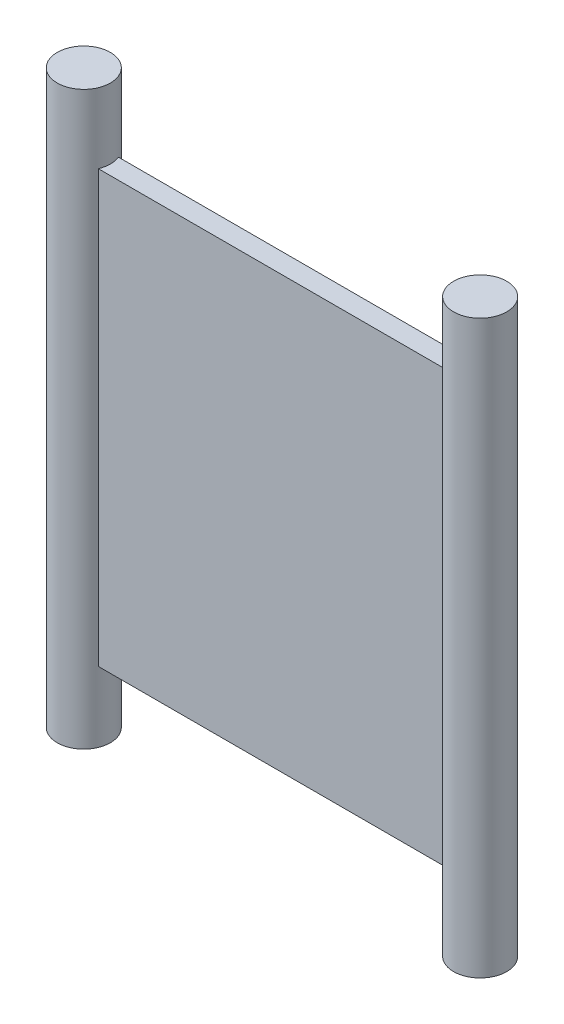
ISO-10303-21;
HEADER;
FILE_DESCRIPTION(('STEP AP214'),'2;1');
FILE_NAME('part.step','',(''),(''),'','','');
FILE_SCHEMA(('AUTOMOTIVE_DESIGN { 1 0 10303 214 1 1 1 1 }'));
ENDSEC;
DATA;
#1=APPLICATION_CONTEXT('core data for automotive mechanical design processes');
#2=APPLICATION_PROTOCOL_DEFINITION('international standard','automotive_design',2000,#1);
#3=PRODUCT_CONTEXT('',#1,'mechanical');
#4=PRODUCT('Part','Part','',(#3));
#5=PRODUCT_RELATED_PRODUCT_CATEGORY('part','',(#4));
#6=PRODUCT_DEFINITION_FORMATION('','',#4);
#7=PRODUCT_DEFINITION_CONTEXT('part definition',#1,'design');
#8=PRODUCT_DEFINITION('design','',#6,#7);
#9=PRODUCT_DEFINITION_SHAPE('','',#8);
#10=(LENGTH_UNIT() NAMED_UNIT(*) SI_UNIT(.MILLI.,.METRE.));
#11=(NAMED_UNIT(*) PLANE_ANGLE_UNIT() SI_UNIT($,.RADIAN.));
#12=(NAMED_UNIT(*) SI_UNIT($,.STERADIAN.) SOLID_ANGLE_UNIT());
#13=UNCERTAINTY_MEASURE_WITH_UNIT(LENGTH_MEASURE(1.E-05),#10,'distance_accuracy_value','');
#14=(GEOMETRIC_REPRESENTATION_CONTEXT(3) GLOBAL_UNCERTAINTY_ASSIGNED_CONTEXT((#13)) GLOBAL_UNIT_ASSIGNED_CONTEXT((#10,
#11,#12)) REPRESENTATION_CONTEXT('',''));
#15=CARTESIAN_POINT('',(0.,0.,0.));
#16=DIRECTION('',(0.,0.,1.));
#17=DIRECTION('',(1.,0.,0.));
#18=AXIS2_PLACEMENT_3D('',#15,#16,#17);
#19=CARTESIAN_POINT('',(9.885,21.5,0.499999999999999));
#20=DIRECTION('',(0.,0.,-1.));
#21=DIRECTION('',(-1.,0.,0.));
#22=AXIS2_PLACEMENT_3D('',#19,#20,#21);
#23=PLANE('',#22);
#24=DIRECTION('',(0.,-1.,0.));
#25=VECTOR('',#24,1.);
#26=CARTESIAN_POINT('',(8.6579608808192,25.,0.499999999999999));
#27=LINE('',#26,#25);
#28=CARTESIAN_POINT('',(8.6579608808192,21.5,0.499999999999999));
#29=VERTEX_POINT('',#28);
#30=CARTESIAN_POINT('',(8.6579608808192,0.,0.499999999999999));
#31=VERTEX_POINT('',#30);
#32=EDGE_CURVE('E53',#29,#31,#27,.T.);
#33=ORIENTED_EDGE('',*,*,#32,.F.);
#34=DIRECTION('',(1.,0.,0.));
#35=VECTOR('',#34,1.);
#36=CARTESIAN_POINT('',(9.885,21.5,0.499999999999999));
#37=LINE('',#36,#35);
#38=CARTESIAN_POINT('',(-8.65796088081919,21.5,0.500000000000001));
#39=VERTEX_POINT('',#38);
#40=EDGE_CURVE('E90',#39,#29,#37,.T.);
#41=ORIENTED_EDGE('',*,*,#40,.F.);
#42=DIRECTION('',(0.,-1.,0.));
#43=VECTOR('',#42,1.);
#44=CARTESIAN_POINT('',(-8.65796088081919,25.,0.500000000000001));
#45=LINE('',#44,#43);
#46=CARTESIAN_POINT('',(-8.65796088081919,0.,0.500000000000001));
#47=VERTEX_POINT('',#46);
#48=EDGE_CURVE('E103',#47,#39,#45,.F.);
#49=ORIENTED_EDGE('',*,*,#48,.F.);
#50=DIRECTION('',(1.,0.,0.));
#51=VECTOR('',#50,1.);
#52=CARTESIAN_POINT('',(9.885,0.,0.499999999999999));
#53=LINE('',#52,#51);
#54=EDGE_CURVE('E91',#47,#31,#53,.T.);
#55=ORIENTED_EDGE('',*,*,#54,.T.);
#56=EDGE_LOOP('',(#33,#41,#49,#55));
#57=FACE_BOUND('',#56,.T.);
#58=ADVANCED_FACE('F39',(#57),#23,.F.);
#59=CARTESIAN_POINT('',(9.885,21.5,-0.500000000000001));
#60=DIRECTION('',(0.,0.,1.));
#61=DIRECTION('',(1.,0.,0.));
#62=AXIS2_PLACEMENT_3D('',#59,#60,#61);
#63=PLANE('',#62);
#64=DIRECTION('',(0.,-1.,0.));
#65=VECTOR('',#64,1.);
#66=CARTESIAN_POINT('',(8.6579608808192,25.,-0.500000000000001));
#67=LINE('',#66,#65);
#68=CARTESIAN_POINT('',(8.6579608808192,0.,-0.500000000000001));
#69=VERTEX_POINT('',#68);
#70=CARTESIAN_POINT('',(8.6579608808192,21.5,-0.500000000000001));
#71=VERTEX_POINT('',#70);
#72=EDGE_CURVE('E78',#69,#71,#67,.F.);
#73=ORIENTED_EDGE('',*,*,#72,.F.);
#74=DIRECTION('',(-1.,0.,0.));
#75=VECTOR('',#74,1.);
#76=CARTESIAN_POINT('',(9.885,0.,-0.500000000000001));
#77=LINE('',#76,#75);
#78=CARTESIAN_POINT('',(-8.65796088081919,0.,-0.499999999999999));
#79=VERTEX_POINT('',#78);
#80=EDGE_CURVE('E60',#69,#79,#77,.T.);
#81=ORIENTED_EDGE('',*,*,#80,.T.);
#82=DIRECTION('',(0.,-1.,0.));
#83=VECTOR('',#82,1.);
#84=CARTESIAN_POINT('',(-8.65796088081919,25.,-0.499999999999999));
#85=LINE('',#84,#83);
#86=CARTESIAN_POINT('',(-8.65796088081919,21.5,-0.499999999999999));
#87=VERTEX_POINT('',#86);
#88=EDGE_CURVE('E105',#87,#79,#85,.T.);
#89=ORIENTED_EDGE('',*,*,#88,.F.);
#90=DIRECTION('',(-1.,0.,0.));
#91=VECTOR('',#90,1.);
#92=CARTESIAN_POINT('',(9.885,21.5,-0.500000000000001));
#93=LINE('',#92,#91);
#94=EDGE_CURVE('E85',#71,#87,#93,.T.);
#95=ORIENTED_EDGE('',*,*,#94,.F.);
#96=EDGE_LOOP('',(#73,#81,#89,#95));
#97=FACE_BOUND('',#96,.T.);
#98=ADVANCED_FACE('F84',(#97),#63,.F.);
#99=CARTESIAN_POINT('',(-9.885,25.,0.));
#100=DIRECTION('',(0.,-1.,0.));
#101=DIRECTION('',(0.,0.,-1.));
#102=AXIS2_PLACEMENT_3D('',#99,#100,#101);
#103=CYLINDRICAL_SURFACE('',#102,1.325);
#104=CARTESIAN_POINT('',(-9.885,25.,0.));
#105=DIRECTION('',(0.,1.,0.));
#106=DIRECTION('',(0.,0.,1.));
#107=AXIS2_PLACEMENT_3D('',#104,#105,#106);
#108=CIRCLE('',#107,1.325);
#109=CARTESIAN_POINT('',(-9.885,25.,1.325));
#110=VERTEX_POINT('',#109);
#111=EDGE_CURVE('E107',#110,#110,#108,.T.);
#112=ORIENTED_EDGE('',*,*,#111,.F.);
#113=EDGE_LOOP('',(#112));
#114=FACE_BOUND('',#113,.T.);
#115=CARTESIAN_POINT('',(-9.885,-3.5,0.));
#116=DIRECTION('',(0.,1.,0.));
#117=DIRECTION('',(0.,0.,1.));
#118=AXIS2_PLACEMENT_3D('',#115,#116,#117);
#119=CIRCLE('',#118,1.325);
#120=CARTESIAN_POINT('',(-9.885,-3.5,1.325));
#121=VERTEX_POINT('',#120);
#122=EDGE_CURVE('E108',#121,#121,#119,.T.);
#123=ORIENTED_EDGE('',*,*,#122,.T.);
#124=EDGE_LOOP('',(#123));
#125=FACE_BOUND('',#124,.T.);
#126=ORIENTED_EDGE('',*,*,#48,.T.);
#127=CARTESIAN_POINT('',(-9.885,21.5,0.));
#128=DIRECTION('',(0.,-1.,0.));
#129=DIRECTION('',(0.,0.,-1.));
#130=AXIS2_PLACEMENT_3D('',#127,#128,#129);
#131=CIRCLE('',#130,1.325);
#132=EDGE_CURVE('E95',#39,#87,#131,.F.);
#133=ORIENTED_EDGE('',*,*,#132,.T.);
#134=ORIENTED_EDGE('',*,*,#88,.T.);
#135=CARTESIAN_POINT('',(-9.885,0.,0.));
#136=DIRECTION('',(0.,-1.,0.));
#137=DIRECTION('',(0.,0.,-1.));
#138=AXIS2_PLACEMENT_3D('',#135,#136,#137);
#139=CIRCLE('',#138,1.325);
#140=EDGE_CURVE('E46',#47,#79,#139,.F.);
#141=ORIENTED_EDGE('',*,*,#140,.F.);
#142=EDGE_LOOP('',(#126,#133,#134,#141));
#143=FACE_BOUND('',#142,.T.);
#144=ADVANCED_FACE('F138',(#114,#125,#143),#103,.T.);
#145=CARTESIAN_POINT('',(-9.885,25.,0.));
#146=DIRECTION('',(0.,1.,0.));
#147=DIRECTION('',(0.,0.,1.));
#148=AXIS2_PLACEMENT_3D('',#145,#146,#147);
#149=PLANE('',#148);
#150=ORIENTED_EDGE('',*,*,#111,.T.);
#151=EDGE_LOOP('',(#150));
#152=FACE_BOUND('',#151,.T.);
#153=ADVANCED_FACE('F144',(#152),#149,.T.);
#154=CARTESIAN_POINT('',(-9.885,-3.5,0.));
#155=DIRECTION('',(0.,1.,0.));
#156=DIRECTION('',(0.,0.,1.));
#157=AXIS2_PLACEMENT_3D('',#154,#155,#156);
#158=PLANE('',#157);
#159=ORIENTED_EDGE('',*,*,#122,.F.);
#160=EDGE_LOOP('',(#159));
#161=FACE_BOUND('',#160,.T.);
#162=ADVANCED_FACE('F150',(#161),#158,.F.);
#163=CARTESIAN_POINT('',(0.,21.5,0.));
#164=DIRECTION('',(0.,-1.,0.));
#165=DIRECTION('',(0.,0.,-1.));
#166=AXIS2_PLACEMENT_3D('',#163,#164,#165);
#167=PLANE('',#166);
#168=CARTESIAN_POINT('',(9.885,21.5,0.));
#169=DIRECTION('',(0.,-1.,0.));
#170=DIRECTION('',(0.,0.,-1.));
#171=AXIS2_PLACEMENT_3D('',#168,#169,#170);
#172=CIRCLE('',#171,1.325);
#173=EDGE_CURVE('E111',#71,#29,#172,.F.);
#174=ORIENTED_EDGE('',*,*,#173,.F.);
#175=ORIENTED_EDGE('',*,*,#94,.T.);
#176=ORIENTED_EDGE('',*,*,#132,.F.);
#177=ORIENTED_EDGE('',*,*,#40,.T.);
#178=EDGE_LOOP('',(#174,#175,#176,#177));
#179=FACE_BOUND('',#178,.T.);
#180=ADVANCED_FACE('F141',(#179),#167,.F.);
#181=CARTESIAN_POINT('',(0.,0.,0.));
#182=DIRECTION('',(0.,-1.,0.));
#183=DIRECTION('',(0.,0.,-1.));
#184=AXIS2_PLACEMENT_3D('',#181,#182,#183);
#185=PLANE('',#184);
#186=ORIENTED_EDGE('',*,*,#80,.F.);
#187=CARTESIAN_POINT('',(9.885,0.,0.));
#188=DIRECTION('',(0.,-1.,0.));
#189=DIRECTION('',(0.,0.,-1.));
#190=AXIS2_PLACEMENT_3D('',#187,#188,#189);
#191=CIRCLE('',#190,1.325);
#192=EDGE_CURVE('E11',#69,#31,#191,.F.);
#193=ORIENTED_EDGE('',*,*,#192,.T.);
#194=ORIENTED_EDGE('',*,*,#54,.F.);
#195=ORIENTED_EDGE('',*,*,#140,.T.);
#196=EDGE_LOOP('',(#186,#193,#194,#195));
#197=FACE_BOUND('',#196,.T.);
#198=ADVANCED_FACE('F89',(#197),#185,.T.);
#199=CARTESIAN_POINT('',(9.885,25.,0.));
#200=DIRECTION('',(0.,-1.,0.));
#201=DIRECTION('',(0.,0.,-1.));
#202=AXIS2_PLACEMENT_3D('',#199,#200,#201);
#203=CYLINDRICAL_SURFACE('',#202,1.325);
#204=CARTESIAN_POINT('',(9.885,25.,0.));
#205=DIRECTION('',(0.,1.,0.));
#206=DIRECTION('',(0.,0.,1.));
#207=AXIS2_PLACEMENT_3D('',#204,#205,#206);
#208=CIRCLE('',#207,1.325);
#209=CARTESIAN_POINT('',(9.885,25.,1.325));
#210=VERTEX_POINT('',#209);
#211=EDGE_CURVE('E116',#210,#210,#208,.T.);
#212=ORIENTED_EDGE('',*,*,#211,.F.);
#213=EDGE_LOOP('',(#212));
#214=FACE_BOUND('',#213,.T.);
#215=CARTESIAN_POINT('',(9.885,-3.5,0.));
#216=DIRECTION('',(0.,1.,0.));
#217=DIRECTION('',(0.,0.,1.));
#218=AXIS2_PLACEMENT_3D('',#215,#216,#217);
#219=CIRCLE('',#218,1.325);
#220=CARTESIAN_POINT('',(9.885,-3.5,1.325));
#221=VERTEX_POINT('',#220);
#222=EDGE_CURVE('E86',#221,#221,#219,.T.);
#223=ORIENTED_EDGE('',*,*,#222,.T.);
#224=EDGE_LOOP('',(#223));
#225=FACE_BOUND('',#224,.T.);
#226=ORIENTED_EDGE('',*,*,#72,.T.);
#227=ORIENTED_EDGE('',*,*,#173,.T.);
#228=ORIENTED_EDGE('',*,*,#32,.T.);
#229=ORIENTED_EDGE('',*,*,#192,.F.);
#230=EDGE_LOOP('',(#226,#227,#228,#229));
#231=FACE_BOUND('',#230,.T.);
#232=ADVANCED_FACE('F77',(#214,#225,#231),#203,.T.);
#233=CARTESIAN_POINT('',(9.885,25.,0.));
#234=DIRECTION('',(0.,1.,0.));
#235=DIRECTION('',(0.,0.,1.));
#236=AXIS2_PLACEMENT_3D('',#233,#234,#235);
#237=PLANE('',#236);
#238=ORIENTED_EDGE('',*,*,#211,.T.);
#239=EDGE_LOOP('',(#238));
#240=FACE_BOUND('',#239,.T.);
#241=ADVANCED_FACE('F125',(#240),#237,.T.);
#242=CARTESIAN_POINT('',(9.885,-3.5,0.));
#243=DIRECTION('',(0.,1.,0.));
#244=DIRECTION('',(0.,0.,1.));
#245=AXIS2_PLACEMENT_3D('',#242,#243,#244);
#246=PLANE('',#245);
#247=ORIENTED_EDGE('',*,*,#222,.F.);
#248=EDGE_LOOP('',(#247));
#249=FACE_BOUND('',#248,.T.);
#250=ADVANCED_FACE('F123',(#249),#246,.F.);
#251=CLOSED_SHELL('',(#58,#98,#144,#153,#162,#180,#198,#232,#241,#250));
#252=MANIFOLD_SOLID_BREP('B2',#251);
#253=ADVANCED_BREP_SHAPE_REPRESENTATION('',(#18,#252),#14);
#254=SHAPE_DEFINITION_REPRESENTATION(#9,#253);
ENDSEC;
END-ISO-10303-21;
